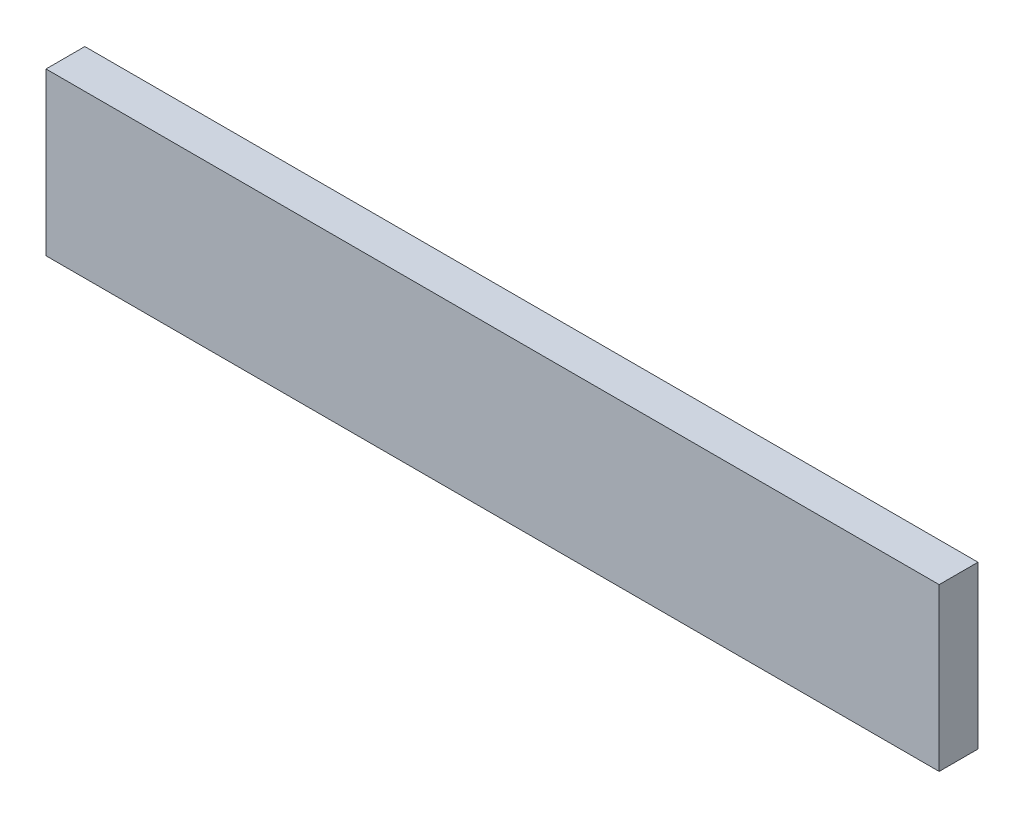
ISO-10303-21;
HEADER;
FILE_DESCRIPTION(('STEP AP214'),'2;1');
FILE_NAME('part.step','',(''),(''),'','','');
FILE_SCHEMA(('AUTOMOTIVE_DESIGN { 1 0 10303 214 1 1 1 1 }'));
ENDSEC;
DATA;
#1=APPLICATION_CONTEXT('core data for automotive mechanical design processes');
#2=APPLICATION_PROTOCOL_DEFINITION('international standard','automotive_design',2000,#1);
#3=PRODUCT_CONTEXT('',#1,'mechanical');
#4=PRODUCT('Part','Part','',(#3));
#5=PRODUCT_RELATED_PRODUCT_CATEGORY('part','',(#4));
#6=PRODUCT_DEFINITION_FORMATION('','',#4);
#7=PRODUCT_DEFINITION_CONTEXT('part definition',#1,'design');
#8=PRODUCT_DEFINITION('design','',#6,#7);
#9=PRODUCT_DEFINITION_SHAPE('','',#8);
#10=(LENGTH_UNIT() NAMED_UNIT(*) SI_UNIT(.MILLI.,.METRE.));
#11=(NAMED_UNIT(*) PLANE_ANGLE_UNIT() SI_UNIT($,.RADIAN.));
#12=(NAMED_UNIT(*) SI_UNIT($,.STERADIAN.) SOLID_ANGLE_UNIT());
#13=UNCERTAINTY_MEASURE_WITH_UNIT(LENGTH_MEASURE(1.E-05),#10,'distance_accuracy_value','');
#14=(GEOMETRIC_REPRESENTATION_CONTEXT(3) GLOBAL_UNCERTAINTY_ASSIGNED_CONTEXT((#13)) GLOBAL_UNIT_ASSIGNED_CONTEXT((#10,
#11,#12)) REPRESENTATION_CONTEXT('',''));
#15=CARTESIAN_POINT('',(0.,0.,0.));
#16=DIRECTION('',(0.,0.,1.));
#17=DIRECTION('',(1.,0.,0.));
#18=AXIS2_PLACEMENT_3D('',#15,#16,#17);
#19=CARTESIAN_POINT('',(0.,0.,12.));
#20=DIRECTION('',(0.,0.,1.));
#21=DIRECTION('',(1.,0.,0.));
#22=AXIS2_PLACEMENT_3D('',#19,#20,#21);
#23=PLANE('',#22);
#24=DIRECTION('',(0.,1.,0.));
#25=VECTOR('',#24,1.);
#26=CARTESIAN_POINT('',(0.,0.,12.));
#27=LINE('',#26,#25);
#28=CARTESIAN_POINT('',(0.,0.,12.));
#29=VERTEX_POINT('',#28);
#30=CARTESIAN_POINT('',(0.,50.,12.));
#31=VERTEX_POINT('',#30);
#32=EDGE_CURVE('E87',#29,#31,#27,.T.);
#33=ORIENTED_EDGE('',*,*,#32,.F.);
#34=DIRECTION('',(1.,0.,0.));
#35=VECTOR('',#34,1.);
#36=CARTESIAN_POINT('',(0.,0.,12.));
#37=LINE('',#36,#35);
#38=CARTESIAN_POINT('',(276.,0.,12.));
#39=VERTEX_POINT('',#38);
#40=EDGE_CURVE('E67',#29,#39,#37,.T.);
#41=ORIENTED_EDGE('',*,*,#40,.T.);
#42=DIRECTION('',(0.,1.,0.));
#43=VECTOR('',#42,1.);
#44=CARTESIAN_POINT('',(276.,0.,12.));
#45=LINE('',#44,#43);
#46=CARTESIAN_POINT('',(276.,50.,12.));
#47=VERTEX_POINT('',#46);
#48=EDGE_CURVE('E81',#39,#47,#45,.T.);
#49=ORIENTED_EDGE('',*,*,#48,.T.);
#50=DIRECTION('',(1.,0.,0.));
#51=VECTOR('',#50,1.);
#52=CARTESIAN_POINT('',(0.,50.,12.));
#53=LINE('',#52,#51);
#54=EDGE_CURVE('E10',#31,#47,#53,.T.);
#55=ORIENTED_EDGE('',*,*,#54,.F.);
#56=EDGE_LOOP('',(#33,#41,#49,#55));
#57=FACE_BOUND('',#56,.T.);
#58=ADVANCED_FACE('F16',(#57),#23,.T.);
#59=CARTESIAN_POINT('',(0.,0.,0.));
#60=DIRECTION('',(0.,0.,1.));
#61=DIRECTION('',(1.,0.,0.));
#62=AXIS2_PLACEMENT_3D('',#59,#60,#61);
#63=PLANE('',#62);
#64=DIRECTION('',(1.,0.,0.));
#65=VECTOR('',#64,1.);
#66=CARTESIAN_POINT('',(0.,50.,0.));
#67=LINE('',#66,#65);
#68=CARTESIAN_POINT('',(0.,50.,0.));
#69=VERTEX_POINT('',#68);
#70=CARTESIAN_POINT('',(276.,50.,0.));
#71=VERTEX_POINT('',#70);
#72=EDGE_CURVE('E24',#69,#71,#67,.T.);
#73=ORIENTED_EDGE('',*,*,#72,.T.);
#74=DIRECTION('',(0.,1.,0.));
#75=VECTOR('',#74,1.);
#76=CARTESIAN_POINT('',(276.,0.,0.));
#77=LINE('',#76,#75);
#78=CARTESIAN_POINT('',(276.,0.,0.));
#79=VERTEX_POINT('',#78);
#80=EDGE_CURVE('E110',#79,#71,#77,.T.);
#81=ORIENTED_EDGE('',*,*,#80,.F.);
#82=DIRECTION('',(1.,0.,0.));
#83=VECTOR('',#82,1.);
#84=CARTESIAN_POINT('',(0.,0.,0.));
#85=LINE('',#84,#83);
#86=CARTESIAN_POINT('',(0.,0.,0.));
#87=VERTEX_POINT('',#86);
#88=EDGE_CURVE('E79',#87,#79,#85,.T.);
#89=ORIENTED_EDGE('',*,*,#88,.F.);
#90=DIRECTION('',(0.,1.,0.));
#91=VECTOR('',#90,1.);
#92=CARTESIAN_POINT('',(0.,0.,0.));
#93=LINE('',#92,#91);
#94=EDGE_CURVE('E86',#87,#69,#93,.T.);
#95=ORIENTED_EDGE('',*,*,#94,.T.);
#96=EDGE_LOOP('',(#73,#81,#89,#95));
#97=FACE_BOUND('',#96,.T.);
#98=ADVANCED_FACE('F113',(#97),#63,.F.);
#99=CARTESIAN_POINT('',(0.,50.,0.));
#100=DIRECTION('',(0.,1.,0.));
#101=DIRECTION('',(1.,0.,0.));
#102=AXIS2_PLACEMENT_3D('',#99,#100,#101);
#103=PLANE('',#102);
#104=ORIENTED_EDGE('',*,*,#72,.F.);
#105=DIRECTION('',(0.,0.,1.));
#106=VECTOR('',#105,1.);
#107=CARTESIAN_POINT('',(0.,50.,0.));
#108=LINE('',#107,#106);
#109=EDGE_CURVE('E95',#69,#31,#108,.T.);
#110=ORIENTED_EDGE('',*,*,#109,.T.);
#111=ORIENTED_EDGE('',*,*,#54,.T.);
#112=DIRECTION('',(0.,0.,1.));
#113=VECTOR('',#112,1.);
#114=CARTESIAN_POINT('',(276.,50.,0.));
#115=LINE('',#114,#113);
#116=EDGE_CURVE('E97',#71,#47,#115,.T.);
#117=ORIENTED_EDGE('',*,*,#116,.F.);
#118=EDGE_LOOP('',(#104,#110,#111,#117));
#119=FACE_BOUND('',#118,.T.);
#120=ADVANCED_FACE('F119',(#119),#103,.T.);
#121=CARTESIAN_POINT('',(0.,0.,0.));
#122=DIRECTION('',(0.,1.,0.));
#123=DIRECTION('',(1.,0.,0.));
#124=AXIS2_PLACEMENT_3D('',#121,#122,#123);
#125=PLANE('',#124);
#126=DIRECTION('',(0.,0.,1.));
#127=VECTOR('',#126,1.);
#128=CARTESIAN_POINT('',(276.,0.,0.));
#129=LINE('',#128,#127);
#130=EDGE_CURVE('E74',#79,#39,#129,.T.);
#131=ORIENTED_EDGE('',*,*,#130,.T.);
#132=ORIENTED_EDGE('',*,*,#40,.F.);
#133=DIRECTION('',(0.,0.,1.));
#134=VECTOR('',#133,1.);
#135=CARTESIAN_POINT('',(0.,0.,0.));
#136=LINE('',#135,#134);
#137=EDGE_CURVE('E71',#87,#29,#136,.T.);
#138=ORIENTED_EDGE('',*,*,#137,.F.);
#139=ORIENTED_EDGE('',*,*,#88,.T.);
#140=EDGE_LOOP('',(#131,#132,#138,#139));
#141=FACE_BOUND('',#140,.T.);
#142=ADVANCED_FACE('F75',(#141),#125,.F.);
#143=CARTESIAN_POINT('',(276.,0.,0.));
#144=DIRECTION('',(1.,0.,0.));
#145=DIRECTION('',(0.,1.,0.));
#146=AXIS2_PLACEMENT_3D('',#143,#144,#145);
#147=PLANE('',#146);
#148=ORIENTED_EDGE('',*,*,#130,.F.);
#149=ORIENTED_EDGE('',*,*,#80,.T.);
#150=ORIENTED_EDGE('',*,*,#116,.T.);
#151=ORIENTED_EDGE('',*,*,#48,.F.);
#152=EDGE_LOOP('',(#148,#149,#150,#151));
#153=FACE_BOUND('',#152,.T.);
#154=ADVANCED_FACE('F117',(#153),#147,.T.);
#155=CARTESIAN_POINT('',(0.,0.,0.));
#156=DIRECTION('',(1.,0.,0.));
#157=DIRECTION('',(0.,1.,0.));
#158=AXIS2_PLACEMENT_3D('',#155,#156,#157);
#159=PLANE('',#158);
#160=ORIENTED_EDGE('',*,*,#32,.T.);
#161=ORIENTED_EDGE('',*,*,#109,.F.);
#162=ORIENTED_EDGE('',*,*,#94,.F.);
#163=ORIENTED_EDGE('',*,*,#137,.T.);
#164=EDGE_LOOP('',(#160,#161,#162,#163));
#165=FACE_BOUND('',#164,.T.);
#166=ADVANCED_FACE('F84',(#165),#159,.F.);
#167=CLOSED_SHELL('',(#58,#98,#120,#142,#154,#166));
#168=MANIFOLD_SOLID_BREP('B1',#167);
#169=ADVANCED_BREP_SHAPE_REPRESENTATION('',(#18,#168),#14);
#170=SHAPE_DEFINITION_REPRESENTATION(#9,#169);
ENDSEC;
END-ISO-10303-21;
